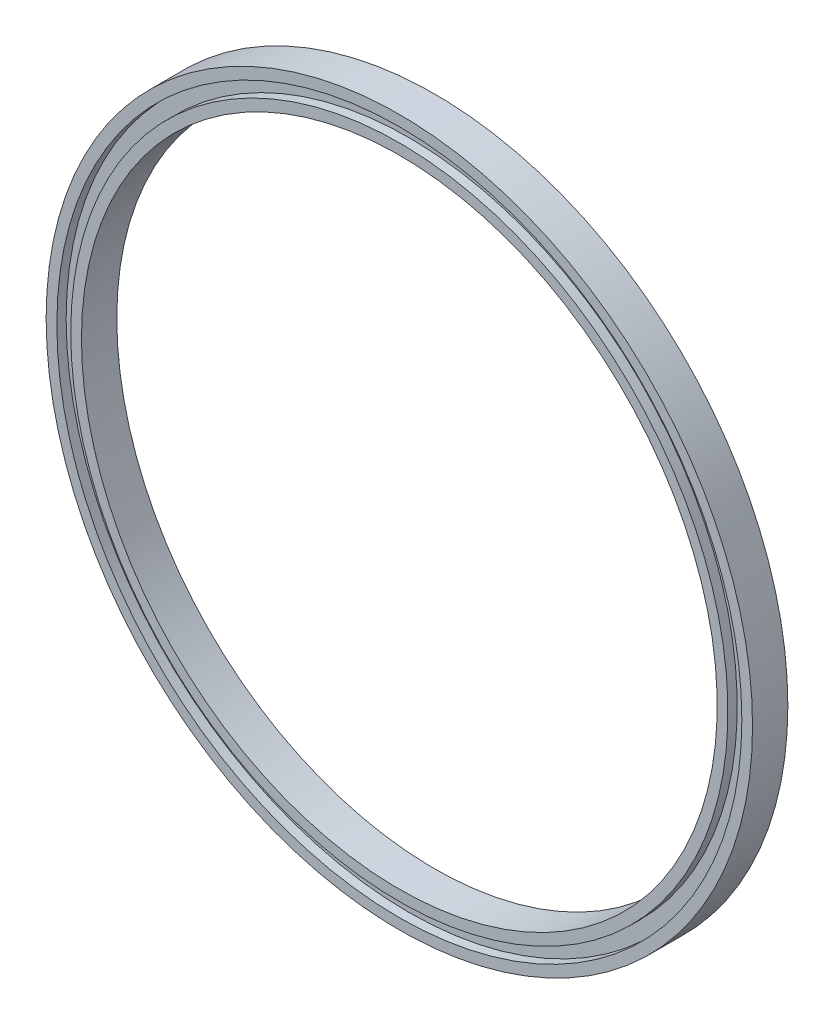
ISO-10303-21;
HEADER;
FILE_DESCRIPTION(('STEP AP214'),'2;1');
FILE_NAME('part.step','',(''),(''),'','','');
FILE_SCHEMA(('AUTOMOTIVE_DESIGN { 1 0 10303 214 1 1 1 1 }'));
ENDSEC;
DATA;
#1=APPLICATION_CONTEXT('core data for automotive mechanical design processes');
#2=APPLICATION_PROTOCOL_DEFINITION('international standard','automotive_design',2000,#1);
#3=PRODUCT_CONTEXT('',#1,'mechanical');
#4=PRODUCT('Part','Part','',(#3));
#5=PRODUCT_RELATED_PRODUCT_CATEGORY('part','',(#4));
#6=PRODUCT_DEFINITION_FORMATION('','',#4);
#7=PRODUCT_DEFINITION_CONTEXT('part definition',#1,'design');
#8=PRODUCT_DEFINITION('design','',#6,#7);
#9=PRODUCT_DEFINITION_SHAPE('','',#8);
#10=(LENGTH_UNIT() NAMED_UNIT(*) SI_UNIT(.MILLI.,.METRE.));
#11=(NAMED_UNIT(*) PLANE_ANGLE_UNIT() SI_UNIT($,.RADIAN.));
#12=(NAMED_UNIT(*) SI_UNIT($,.STERADIAN.) SOLID_ANGLE_UNIT());
#13=UNCERTAINTY_MEASURE_WITH_UNIT(LENGTH_MEASURE(1.E-05),#10,'distance_accuracy_value','');
#14=(GEOMETRIC_REPRESENTATION_CONTEXT(3) GLOBAL_UNCERTAINTY_ASSIGNED_CONTEXT((#13)) GLOBAL_UNIT_ASSIGNED_CONTEXT((#10,
#11,#12)) REPRESENTATION_CONTEXT('',''));
#15=CARTESIAN_POINT('',(0.,0.,0.));
#16=DIRECTION('',(0.,0.,1.));
#17=DIRECTION('',(1.,0.,0.));
#18=AXIS2_PLACEMENT_3D('',#15,#16,#17);
#19=CARTESIAN_POINT('',(0.,63.5,-3.175));
#20=DIRECTION('',(0.,0.,-1.));
#21=DIRECTION('',(-1.,0.,0.));
#22=AXIS2_PLACEMENT_3D('',#19,#20,#21);
#23=PLANE('',#22);
#24=CARTESIAN_POINT('',(0.,0.,-3.175));
#25=DIRECTION('',(0.,0.,-1.));
#26=DIRECTION('',(-1.,0.,0.));
#27=AXIS2_PLACEMENT_3D('',#24,#25,#26);
#28=CIRCLE('',#27,63.5);
#29=CARTESIAN_POINT('',(-63.5,0.,-3.175));
#30=VERTEX_POINT('',#29);
#31=EDGE_CURVE('E85',#30,#30,#28,.T.);
#32=ORIENTED_EDGE('',*,*,#31,.T.);
#33=EDGE_LOOP('',(#32));
#34=FACE_BOUND('',#33,.T.);
#35=CARTESIAN_POINT('',(0.,0.,-3.175));
#36=DIRECTION('',(0.,0.,-1.));
#37=DIRECTION('',(-1.,0.,0.));
#38=AXIS2_PLACEMENT_3D('',#35,#36,#37);
#39=CIRCLE('',#38,61.575);
#40=CARTESIAN_POINT('',(-61.575,0.,-3.175));
#41=VERTEX_POINT('',#40);
#42=EDGE_CURVE('E10',#41,#41,#39,.T.);
#43=ORIENTED_EDGE('',*,*,#42,.F.);
#44=EDGE_LOOP('',(#43));
#45=FACE_BOUND('',#44,.T.);
#46=ADVANCED_FACE('F45',(#34,#45),#23,.T.);
#47=CARTESIAN_POINT('',(0.,0.,0.));
#48=DIRECTION('',(0.,0.,-1.));
#49=DIRECTION('',(-1.,0.,0.));
#50=AXIS2_PLACEMENT_3D('',#47,#48,#49);
#51=CYLINDRICAL_SURFACE('',#50,61.575);
#52=ORIENTED_EDGE('',*,*,#42,.T.);
#53=EDGE_LOOP('',(#52));
#54=FACE_BOUND('',#53,.T.);
#55=CARTESIAN_POINT('',(0.,0.,-1.5));
#56=DIRECTION('',(0.,0.,-1.));
#57=DIRECTION('',(-1.,0.,0.));
#58=AXIS2_PLACEMENT_3D('',#55,#56,#57);
#59=CIRCLE('',#58,61.575);
#60=CARTESIAN_POINT('',(-61.575,0.,-1.5));
#61=VERTEX_POINT('',#60);
#62=EDGE_CURVE('E51',#61,#61,#59,.T.);
#63=ORIENTED_EDGE('',*,*,#62,.F.);
#64=EDGE_LOOP('',(#63));
#65=FACE_BOUND('',#64,.T.);
#66=ADVANCED_FACE('F103',(#54,#65),#51,.F.);
#67=CARTESIAN_POINT('',(0.,61.575,-1.5));
#68=DIRECTION('',(0.,0.,-1.));
#69=DIRECTION('',(-1.,0.,0.));
#70=AXIS2_PLACEMENT_3D('',#67,#68,#69);
#71=PLANE('',#70);
#72=ORIENTED_EDGE('',*,*,#62,.T.);
#73=EDGE_LOOP('',(#72));
#74=FACE_BOUND('',#73,.T.);
#75=CARTESIAN_POINT('',(0.,0.,-1.5));
#76=DIRECTION('',(0.,0.,-1.));
#77=DIRECTION('',(-1.,0.,0.));
#78=AXIS2_PLACEMENT_3D('',#75,#76,#77);
#79=CIRCLE('',#78,59.075);
#80=CARTESIAN_POINT('',(-59.075,0.,-1.5));
#81=VERTEX_POINT('',#80);
#82=EDGE_CURVE('E55',#81,#81,#79,.T.);
#83=ORIENTED_EDGE('',*,*,#82,.F.);
#84=EDGE_LOOP('',(#83));
#85=FACE_BOUND('',#84,.T.);
#86=ADVANCED_FACE('F107',(#74,#85),#71,.T.);
#87=CARTESIAN_POINT('',(0.,0.,0.));
#88=DIRECTION('',(0.,0.,-1.));
#89=DIRECTION('',(-1.,0.,0.));
#90=AXIS2_PLACEMENT_3D('',#87,#88,#89);
#91=CYLINDRICAL_SURFACE('',#90,59.075);
#92=ORIENTED_EDGE('',*,*,#82,.T.);
#93=EDGE_LOOP('',(#92));
#94=FACE_BOUND('',#93,.T.);
#95=CARTESIAN_POINT('',(0.,0.,-3.175));
#96=DIRECTION('',(0.,0.,-1.));
#97=DIRECTION('',(-1.,0.,0.));
#98=AXIS2_PLACEMENT_3D('',#95,#96,#97);
#99=CIRCLE('',#98,59.075);
#100=CARTESIAN_POINT('',(-59.075,0.,-3.175));
#101=VERTEX_POINT('',#100);
#102=EDGE_CURVE('E59',#101,#101,#99,.T.);
#103=ORIENTED_EDGE('',*,*,#102,.F.);
#104=EDGE_LOOP('',(#103));
#105=FACE_BOUND('',#104,.T.);
#106=ADVANCED_FACE('F112',(#94,#105),#91,.T.);
#107=CARTESIAN_POINT('',(0.,57.15,-3.175));
#108=DIRECTION('',(0.,0.,-1.));
#109=DIRECTION('',(-1.,0.,0.));
#110=AXIS2_PLACEMENT_3D('',#107,#108,#109);
#111=PLANE('',#110);
#112=ORIENTED_EDGE('',*,*,#102,.T.);
#113=EDGE_LOOP('',(#112));
#114=FACE_BOUND('',#113,.T.);
#115=CARTESIAN_POINT('',(0.,0.,-3.175));
#116=DIRECTION('',(0.,0.,-1.));
#117=DIRECTION('',(-1.,0.,0.));
#118=AXIS2_PLACEMENT_3D('',#115,#116,#117);
#119=CIRCLE('',#118,57.15);
#120=CARTESIAN_POINT('',(-57.15,0.,-3.175));
#121=VERTEX_POINT('',#120);
#122=EDGE_CURVE('E64',#121,#121,#119,.T.);
#123=ORIENTED_EDGE('',*,*,#122,.F.);
#124=EDGE_LOOP('',(#123));
#125=FACE_BOUND('',#124,.T.);
#126=ADVANCED_FACE('F118',(#114,#125),#111,.T.);
#127=CARTESIAN_POINT('',(0.,0.,0.));
#128=DIRECTION('',(0.,0.,-1.));
#129=DIRECTION('',(-1.,0.,0.));
#130=AXIS2_PLACEMENT_3D('',#127,#128,#129);
#131=CYLINDRICAL_SURFACE('',#130,57.15);
#132=ORIENTED_EDGE('',*,*,#122,.T.);
#133=EDGE_LOOP('',(#132));
#134=FACE_BOUND('',#133,.T.);
#135=CARTESIAN_POINT('',(0.,0.,3.175));
#136=DIRECTION('',(0.,0.,-1.));
#137=DIRECTION('',(-1.,0.,0.));
#138=AXIS2_PLACEMENT_3D('',#135,#136,#137);
#139=CIRCLE('',#138,57.15);
#140=CARTESIAN_POINT('',(-57.15,0.,3.175));
#141=VERTEX_POINT('',#140);
#142=EDGE_CURVE('E67',#141,#141,#139,.T.);
#143=ORIENTED_EDGE('',*,*,#142,.F.);
#144=EDGE_LOOP('',(#143));
#145=FACE_BOUND('',#144,.T.);
#146=ADVANCED_FACE('F122',(#134,#145),#131,.F.);
#147=CARTESIAN_POINT('',(0.,57.15,3.175));
#148=DIRECTION('',(0.,0.,1.));
#149=DIRECTION('',(1.,0.,0.));
#150=AXIS2_PLACEMENT_3D('',#147,#148,#149);
#151=PLANE('',#150);
#152=ORIENTED_EDGE('',*,*,#142,.T.);
#153=EDGE_LOOP('',(#152));
#154=FACE_BOUND('',#153,.T.);
#155=CARTESIAN_POINT('',(0.,0.,3.175));
#156=DIRECTION('',(0.,0.,-1.));
#157=DIRECTION('',(-1.,0.,0.));
#158=AXIS2_PLACEMENT_3D('',#155,#156,#157);
#159=CIRCLE('',#158,59.075);
#160=CARTESIAN_POINT('',(-59.075,0.,3.175));
#161=VERTEX_POINT('',#160);
#162=EDGE_CURVE('E70',#161,#161,#159,.T.);
#163=ORIENTED_EDGE('',*,*,#162,.F.);
#164=EDGE_LOOP('',(#163));
#165=FACE_BOUND('',#164,.T.);
#166=ADVANCED_FACE('F126',(#154,#165),#151,.T.);
#167=CARTESIAN_POINT('',(0.,0.,0.));
#168=DIRECTION('',(0.,0.,-1.));
#169=DIRECTION('',(-1.,0.,0.));
#170=AXIS2_PLACEMENT_3D('',#167,#168,#169);
#171=CYLINDRICAL_SURFACE('',#170,59.075);
#172=ORIENTED_EDGE('',*,*,#162,.T.);
#173=EDGE_LOOP('',(#172));
#174=FACE_BOUND('',#173,.T.);
#175=CARTESIAN_POINT('',(0.,0.,1.5));
#176=DIRECTION('',(0.,0.,-1.));
#177=DIRECTION('',(-1.,0.,0.));
#178=AXIS2_PLACEMENT_3D('',#175,#176,#177);
#179=CIRCLE('',#178,59.075);
#180=CARTESIAN_POINT('',(-59.075,0.,1.5));
#181=VERTEX_POINT('',#180);
#182=EDGE_CURVE('E73',#181,#181,#179,.T.);
#183=ORIENTED_EDGE('',*,*,#182,.F.);
#184=EDGE_LOOP('',(#183));
#185=FACE_BOUND('',#184,.T.);
#186=ADVANCED_FACE('F130',(#174,#185),#171,.T.);
#187=CARTESIAN_POINT('',(0.,61.575,1.5));
#188=DIRECTION('',(0.,0.,1.));
#189=DIRECTION('',(1.,0.,0.));
#190=AXIS2_PLACEMENT_3D('',#187,#188,#189);
#191=PLANE('',#190);
#192=ORIENTED_EDGE('',*,*,#182,.T.);
#193=EDGE_LOOP('',(#192));
#194=FACE_BOUND('',#193,.T.);
#195=CARTESIAN_POINT('',(0.,0.,1.5));
#196=DIRECTION('',(0.,0.,-1.));
#197=DIRECTION('',(-1.,0.,0.));
#198=AXIS2_PLACEMENT_3D('',#195,#196,#197);
#199=CIRCLE('',#198,61.575);
#200=CARTESIAN_POINT('',(-61.575,0.,1.5));
#201=VERTEX_POINT('',#200);
#202=EDGE_CURVE('E76',#201,#201,#199,.T.);
#203=ORIENTED_EDGE('',*,*,#202,.F.);
#204=EDGE_LOOP('',(#203));
#205=FACE_BOUND('',#204,.T.);
#206=ADVANCED_FACE('F134',(#194,#205),#191,.T.);
#207=CARTESIAN_POINT('',(0.,0.,0.));
#208=DIRECTION('',(0.,0.,-1.));
#209=DIRECTION('',(-1.,0.,0.));
#210=AXIS2_PLACEMENT_3D('',#207,#208,#209);
#211=CYLINDRICAL_SURFACE('',#210,61.575);
#212=ORIENTED_EDGE('',*,*,#202,.T.);
#213=EDGE_LOOP('',(#212));
#214=FACE_BOUND('',#213,.T.);
#215=CARTESIAN_POINT('',(0.,0.,3.175));
#216=DIRECTION('',(0.,0.,-1.));
#217=DIRECTION('',(-1.,0.,0.));
#218=AXIS2_PLACEMENT_3D('',#215,#216,#217);
#219=CIRCLE('',#218,61.575);
#220=CARTESIAN_POINT('',(-61.575,0.,3.175));
#221=VERTEX_POINT('',#220);
#222=EDGE_CURVE('E79',#221,#221,#219,.T.);
#223=ORIENTED_EDGE('',*,*,#222,.F.);
#224=EDGE_LOOP('',(#223));
#225=FACE_BOUND('',#224,.T.);
#226=ADVANCED_FACE('F99',(#214,#225),#211,.F.);
#227=CARTESIAN_POINT('',(0.,63.5,3.175));
#228=DIRECTION('',(0.,0.,1.));
#229=DIRECTION('',(1.,0.,0.));
#230=AXIS2_PLACEMENT_3D('',#227,#228,#229);
#231=PLANE('',#230);
#232=ORIENTED_EDGE('',*,*,#222,.T.);
#233=EDGE_LOOP('',(#232));
#234=FACE_BOUND('',#233,.T.);
#235=CARTESIAN_POINT('',(0.,0.,3.175));
#236=DIRECTION('',(0.,0.,-1.));
#237=DIRECTION('',(-1.,0.,0.));
#238=AXIS2_PLACEMENT_3D('',#235,#236,#237);
#239=CIRCLE('',#238,63.5);
#240=CARTESIAN_POINT('',(-63.5,0.,3.175));
#241=VERTEX_POINT('',#240);
#242=EDGE_CURVE('E82',#241,#241,#239,.T.);
#243=ORIENTED_EDGE('',*,*,#242,.F.);
#244=EDGE_LOOP('',(#243));
#245=FACE_BOUND('',#244,.T.);
#246=ADVANCED_FACE('F93',(#234,#245),#231,.T.);
#247=CARTESIAN_POINT('',(0.,0.,0.));
#248=DIRECTION('',(0.,0.,-1.));
#249=DIRECTION('',(-1.,0.,0.));
#250=AXIS2_PLACEMENT_3D('',#247,#248,#249);
#251=CYLINDRICAL_SURFACE('',#250,63.5);
#252=ORIENTED_EDGE('',*,*,#242,.T.);
#253=EDGE_LOOP('',(#252));
#254=FACE_BOUND('',#253,.T.);
#255=ORIENTED_EDGE('',*,*,#31,.F.);
#256=EDGE_LOOP('',(#255));
#257=FACE_BOUND('',#256,.T.);
#258=ADVANCED_FACE('F91',(#254,#257),#251,.T.);
#259=CLOSED_SHELL('',(#46,#66,#86,#106,#126,#146,#166,#186,#206,#226,#246,#258));
#260=MANIFOLD_SOLID_BREP('B2',#259);
#261=ADVANCED_BREP_SHAPE_REPRESENTATION('',(#18,#260),#14);
#262=SHAPE_DEFINITION_REPRESENTATION(#9,#261);
ENDSEC;
END-ISO-10303-21;
